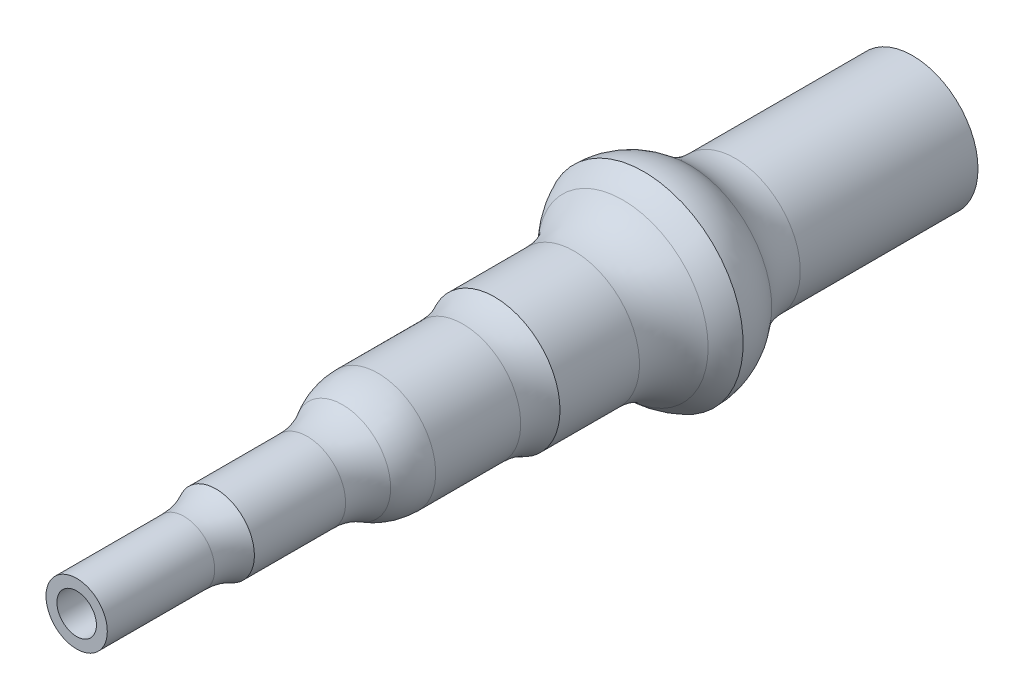
ISO-10303-21;
HEADER;
FILE_DESCRIPTION(('STEP AP214'),'2;1');
FILE_NAME('part.step','',(''),(''),'','','');
FILE_SCHEMA(('AUTOMOTIVE_DESIGN { 1 0 10303 214 1 1 1 1 }'));
ENDSEC;
DATA;
#1=APPLICATION_CONTEXT('core data for automotive mechanical design processes');
#2=APPLICATION_PROTOCOL_DEFINITION('international standard','automotive_design',2000,#1);
#3=PRODUCT_CONTEXT('',#1,'mechanical');
#4=PRODUCT('Part','Part','',(#3));
#5=PRODUCT_RELATED_PRODUCT_CATEGORY('part','',(#4));
#6=PRODUCT_DEFINITION_FORMATION('','',#4);
#7=PRODUCT_DEFINITION_CONTEXT('part definition',#1,'design');
#8=PRODUCT_DEFINITION('design','',#6,#7);
#9=PRODUCT_DEFINITION_SHAPE('','',#8);
#10=(LENGTH_UNIT() NAMED_UNIT(*) SI_UNIT(.MILLI.,.METRE.));
#11=(NAMED_UNIT(*) PLANE_ANGLE_UNIT() SI_UNIT($,.RADIAN.));
#12=(NAMED_UNIT(*) SI_UNIT($,.STERADIAN.) SOLID_ANGLE_UNIT());
#13=UNCERTAINTY_MEASURE_WITH_UNIT(LENGTH_MEASURE(1.E-05),#10,'distance_accuracy_value','');
#14=(GEOMETRIC_REPRESENTATION_CONTEXT(3) GLOBAL_UNCERTAINTY_ASSIGNED_CONTEXT((#13)) GLOBAL_UNIT_ASSIGNED_CONTEXT((#10,
#11,#12)) REPRESENTATION_CONTEXT('',''));
#15=CARTESIAN_POINT('',(0.,0.,0.));
#16=DIRECTION('',(0.,0.,1.));
#17=DIRECTION('',(1.,0.,0.));
#18=AXIS2_PLACEMENT_3D('',#15,#16,#17);
#19=CARTESIAN_POINT('',(0.,0.,30.));
#20=DIRECTION('',(0.,0.,-1.));
#21=DIRECTION('',(-1.,0.,0.));
#22=AXIS2_PLACEMENT_3D('',#19,#20,#21);
#23=CYLINDRICAL_SURFACE('',#22,4.69);
#24=CARTESIAN_POINT('',(0.,0.,24.2950060901503));
#25=DIRECTION('',(0.,0.,-1.));
#26=DIRECTION('',(-1.,0.,0.));
#27=AXIS2_PLACEMENT_3D('',#24,#25,#26);
#28=CIRCLE('',#27,4.69);
#29=CARTESIAN_POINT('',(-4.69,0.,24.2950060901503));
#30=VERTEX_POINT('',#29);
#31=EDGE_CURVE('E60',#30,#30,#28,.F.);
#32=ORIENTED_EDGE('',*,*,#31,.T.);
#33=EDGE_LOOP('',(#32));
#34=FACE_BOUND('',#33,.T.);
#35=CARTESIAN_POINT('',(0.,0.,30.));
#36=DIRECTION('',(0.,0.,1.));
#37=DIRECTION('',(1.,0.,0.));
#38=AXIS2_PLACEMENT_3D('',#35,#36,#37);
#39=CIRCLE('',#38,4.69);
#40=CARTESIAN_POINT('',(4.69,0.,30.));
#41=VERTEX_POINT('',#40);
#42=EDGE_CURVE('E96',#41,#41,#39,.T.);
#43=ORIENTED_EDGE('',*,*,#42,.F.);
#44=EDGE_LOOP('',(#43));
#45=FACE_BOUND('',#44,.T.);
#46=ADVANCED_FACE('F31',(#34,#45),#23,.T.);
#47=CARTESIAN_POINT('',(0.,0.,40.));
#48=DIRECTION('',(0.,0.,-1.));
#49=DIRECTION('',(-1.,0.,0.));
#50=AXIS2_PLACEMENT_3D('',#47,#48,#49);
#51=CYLINDRICAL_SURFACE('',#50,4.14334423021434);
#52=CARTESIAN_POINT('',(0.,0.,32.2732631099845));
#53=DIRECTION('',(0.,0.,-1.));
#54=DIRECTION('',(-1.,0.,0.));
#55=AXIS2_PLACEMENT_3D('',#52,#53,#54);
#56=CIRCLE('',#55,4.14334423021434);
#57=CARTESIAN_POINT('',(-4.14334423021434,0.,32.2732631099845));
#58=VERTEX_POINT('',#57);
#59=EDGE_CURVE('E63',#58,#58,#56,.F.);
#60=ORIENTED_EDGE('',*,*,#59,.T.);
#61=EDGE_LOOP('',(#60));
#62=FACE_BOUND('',#61,.T.);
#63=CARTESIAN_POINT('',(0.,0.,38.3759198147124));
#64=DIRECTION('',(0.,0.,-1.));
#65=DIRECTION('',(-1.,0.,0.));
#66=AXIS2_PLACEMENT_3D('',#63,#64,#65);
#67=CIRCLE('',#66,4.14334423021434);
#68=CARTESIAN_POINT('',(-4.14334423021434,0.,38.3759198147124));
#69=VERTEX_POINT('',#68);
#70=EDGE_CURVE('E66',#69,#69,#67,.T.);
#71=ORIENTED_EDGE('',*,*,#70,.T.);
#72=EDGE_LOOP('',(#71));
#73=FACE_BOUND('',#72,.T.);
#74=ADVANCED_FACE('F136',(#62,#73),#51,.T.);
#75=CARTESIAN_POINT('',(0.,0.,40.));
#76=DIRECTION('',(0.,0.,-1.));
#77=DIRECTION('',(-1.,0.,0.));
#78=AXIS2_PLACEMENT_3D('',#75,#76,#77);
#79=CYLINDRICAL_SURFACE('',#78,2.73982414802436);
#80=CARTESIAN_POINT('',(0.,0.,33.0380674905884));
#81=DIRECTION('',(0.,0.,-1.));
#82=DIRECTION('',(-1.,0.,0.));
#83=AXIS2_PLACEMENT_3D('',#80,#81,#82);
#84=CIRCLE('',#83,2.73982414802436);
#85=CARTESIAN_POINT('',(-2.73982414802436,0.,33.0380674905884));
#86=VERTEX_POINT('',#85);
#87=EDGE_CURVE('E42',#86,#86,#84,.T.);
#88=ORIENTED_EDGE('',*,*,#87,.T.);
#89=EDGE_LOOP('',(#88));
#90=FACE_BOUND('',#89,.T.);
#91=CARTESIAN_POINT('',(0.,0.,38.5935648672262));
#92=DIRECTION('',(0.,0.,1.));
#93=DIRECTION('',(1.,0.,0.));
#94=AXIS2_PLACEMENT_3D('',#91,#92,#93);
#95=CIRCLE('',#94,2.73982414802436);
#96=CARTESIAN_POINT('',(2.73982414802436,0.,38.5935648672262));
#97=VERTEX_POINT('',#96);
#98=EDGE_CURVE('E75',#97,#97,#95,.T.);
#99=ORIENTED_EDGE('',*,*,#98,.T.);
#100=EDGE_LOOP('',(#99));
#101=FACE_BOUND('',#100,.T.);
#102=ADVANCED_FACE('F141',(#90,#101),#79,.F.);
#103=CARTESIAN_POINT('',(0.,0.,50.));
#104=DIRECTION('',(0.,0.,-1.));
#105=DIRECTION('',(-1.,0.,0.));
#106=AXIS2_PLACEMENT_3D('',#103,#104,#105);
#107=CYLINDRICAL_SURFACE('',#106,2.75719872310931);
#108=CARTESIAN_POINT('',(0.,0.,43.4554385690072));
#109=DIRECTION('',(0.,0.,-1.));
#110=DIRECTION('',(-1.,0.,0.));
#111=AXIS2_PLACEMENT_3D('',#108,#109,#110);
#112=CIRCLE('',#111,2.75719872310931);
#113=CARTESIAN_POINT('',(-2.75719872310931,0.,43.4554385690072));
#114=VERTEX_POINT('',#113);
#115=EDGE_CURVE('E78',#114,#114,#112,.F.);
#116=ORIENTED_EDGE('',*,*,#115,.T.);
#117=EDGE_LOOP('',(#116));
#118=FACE_BOUND('',#117,.T.);
#119=CARTESIAN_POINT('',(0.,0.,50.));
#120=DIRECTION('',(0.,0.,1.));
#121=DIRECTION('',(1.,0.,0.));
#122=AXIS2_PLACEMENT_3D('',#119,#120,#121);
#123=CIRCLE('',#122,2.75719872310931);
#124=CARTESIAN_POINT('',(2.75719872310931,0.,50.));
#125=VERTEX_POINT('',#124);
#126=EDGE_CURVE('E100',#125,#125,#123,.T.);
#127=ORIENTED_EDGE('',*,*,#126,.F.);
#128=EDGE_LOOP('',(#127));
#129=FACE_BOUND('',#128,.T.);
#130=ADVANCED_FACE('F165',(#118,#129),#107,.T.);
#131=CARTESIAN_POINT('',(0.,0.,50.));
#132=DIRECTION('',(0.,0.,-1.));
#133=DIRECTION('',(-1.,0.,0.));
#134=AXIS2_PLACEMENT_3D('',#131,#132,#133);
#135=CYLINDRICAL_SURFACE('',#134,1.67402831957278);
#136=CARTESIAN_POINT('',(0.,0.,43.0857798911411));
#137=DIRECTION('',(0.,0.,-1.));
#138=DIRECTION('',(-1.,0.,0.));
#139=AXIS2_PLACEMENT_3D('',#136,#137,#138);
#140=CIRCLE('',#139,1.67402831957278);
#141=CARTESIAN_POINT('',(-1.67402831957278,0.,43.0857798911411));
#142=VERTEX_POINT('',#141);
#143=EDGE_CURVE('E81',#142,#142,#140,.T.);
#144=ORIENTED_EDGE('',*,*,#143,.T.);
#145=EDGE_LOOP('',(#144));
#146=FACE_BOUND('',#145,.T.);
#147=CARTESIAN_POINT('',(0.,0.,49.3307572842467));
#148=DIRECTION('',(0.,0.,1.));
#149=DIRECTION('',(1.,0.,0.));
#150=AXIS2_PLACEMENT_3D('',#147,#148,#149);
#151=CIRCLE('',#150,1.67402831957278);
#152=CARTESIAN_POINT('',(1.67402831957278,0.,49.3307572842467));
#153=VERTEX_POINT('',#152);
#154=EDGE_CURVE('E90',#153,#153,#151,.T.);
#155=ORIENTED_EDGE('',*,*,#154,.T.);
#156=EDGE_LOOP('',(#155));
#157=FACE_BOUND('',#156,.T.);
#158=ADVANCED_FACE('F168',(#146,#157),#135,.F.);
#159=CARTESIAN_POINT('',(0.,0.,60.));
#160=DIRECTION('',(0.,0.,1.));
#161=DIRECTION('',(1.,0.,0.));
#162=AXIS2_PLACEMENT_3D('',#159,#160,#161);
#163=PLANE('',#162);
#164=CARTESIAN_POINT('',(0.,0.,60.));
#165=DIRECTION('',(0.,0.,1.));
#166=DIRECTION('',(1.,0.,0.));
#167=AXIS2_PLACEMENT_3D('',#164,#165,#166);
#168=CIRCLE('',#167,2.2);
#169=CARTESIAN_POINT('',(2.2,0.,60.));
#170=VERTEX_POINT('',#169);
#171=EDGE_CURVE('E105',#170,#170,#168,.T.);
#172=ORIENTED_EDGE('',*,*,#171,.T.);
#173=EDGE_LOOP('',(#172));
#174=FACE_BOUND('',#173,.T.);
#175=CARTESIAN_POINT('',(0.,0.,60.));
#176=DIRECTION('',(0.,0.,1.));
#177=DIRECTION('',(1.,0.,0.));
#178=AXIS2_PLACEMENT_3D('',#175,#176,#177);
#179=CIRCLE('',#178,1.41771522397472);
#180=CARTESIAN_POINT('',(1.41771522397472,0.,60.));
#181=VERTEX_POINT('',#180);
#182=EDGE_CURVE('E108',#181,#181,#179,.T.);
#183=ORIENTED_EDGE('',*,*,#182,.F.);
#184=EDGE_LOOP('',(#183));
#185=FACE_BOUND('',#184,.T.);
#186=ADVANCED_FACE('F183',(#174,#185),#163,.T.);
#187=CARTESIAN_POINT('',(0.,0.,60.));
#188=DIRECTION('',(0.,0.,-1.));
#189=DIRECTION('',(-1.,0.,0.));
#190=AXIS2_PLACEMENT_3D('',#187,#188,#189);
#191=CYLINDRICAL_SURFACE('',#190,2.2);
#192=CARTESIAN_POINT('',(0.,0.,52.293799645579));
#193=DIRECTION('',(0.,0.,-1.));
#194=DIRECTION('',(-1.,0.,0.));
#195=AXIS2_PLACEMENT_3D('',#192,#193,#194);
#196=CIRCLE('',#195,2.2);
#197=CARTESIAN_POINT('',(-2.2,0.,52.293799645579));
#198=VERTEX_POINT('',#197);
#199=EDGE_CURVE('E84',#198,#198,#196,.F.);
#200=ORIENTED_EDGE('',*,*,#199,.T.);
#201=EDGE_LOOP('',(#200));
#202=FACE_BOUND('',#201,.T.);
#203=ORIENTED_EDGE('',*,*,#171,.F.);
#204=EDGE_LOOP('',(#203));
#205=FACE_BOUND('',#204,.T.);
#206=ADVANCED_FACE('F179',(#202,#205),#191,.T.);
#207=CARTESIAN_POINT('',(0.,0.,60.));
#208=DIRECTION('',(0.,0.,-1.));
#209=DIRECTION('',(-1.,0.,0.));
#210=AXIS2_PLACEMENT_3D('',#207,#208,#209);
#211=CYLINDRICAL_SURFACE('',#210,1.41771522397472);
#212=CARTESIAN_POINT('',(0.,0.,51.5803273562795));
#213=DIRECTION('',(0.,0.,-1.));
#214=DIRECTION('',(-1.,0.,0.));
#215=AXIS2_PLACEMENT_3D('',#212,#213,#214);
#216=CIRCLE('',#215,1.41771522397472);
#217=CARTESIAN_POINT('',(-1.41771522397472,0.,51.5803273562795));
#218=VERTEX_POINT('',#217);
#219=EDGE_CURVE('E93',#218,#218,#216,.T.);
#220=ORIENTED_EDGE('',*,*,#219,.T.);
#221=EDGE_LOOP('',(#220));
#222=FACE_BOUND('',#221,.T.);
#223=ORIENTED_EDGE('',*,*,#182,.T.);
#224=EDGE_LOOP('',(#223));
#225=FACE_BOUND('',#224,.T.);
#226=ADVANCED_FACE('F182',(#222,#225),#211,.F.);
#227=CARTESIAN_POINT('',(0.,0.,51.5803273562795));
#228=DIRECTION('',(0.,0.,-1.));
#229=DIRECTION('',(-1.,0.,0.));
#230=AXIS2_PLACEMENT_3D('',#227,#228,#229);
#231=TOROIDAL_SURFACE('',#230,6.41771522397472,5.);
#232=CARTESIAN_POINT('',(0.,0.,50.4555423202631));
#233=DIRECTION('',(0.,0.,1.));
#234=DIRECTION('',(1.,0.,0.));
#235=AXIS2_PLACEMENT_3D('',#232,#233,#234);
#236=CIRCLE('',#235,1.54587177177375);
#237=CARTESIAN_POINT('',(1.54587177177375,0.,50.4555423202631));
#238=VERTEX_POINT('',#237);
#239=EDGE_CURVE('E87',#238,#238,#236,.F.);
#240=ORIENTED_EDGE('',*,*,#239,.T.);
#241=EDGE_LOOP('',(#240));
#242=FACE_BOUND('',#241,.T.);
#243=ORIENTED_EDGE('',*,*,#219,.F.);
#244=EDGE_LOOP('',(#243));
#245=FACE_BOUND('',#244,.T.);
#246=ADVANCED_FACE('F193',(#242,#245),#231,.T.);
#247=CARTESIAN_POINT('',(0.,0.,49.3307572842467));
#248=DIRECTION('',(0.,0.,1.));
#249=DIRECTION('',(1.,0.,0.));
#250=AXIS2_PLACEMENT_3D('',#247,#248,#249);
#251=DEGENERATE_TOROIDAL_SURFACE('',#250,3.32597168042722,5.,.F.);
#252=ORIENTED_EDGE('',*,*,#239,.F.);
#253=EDGE_LOOP('',(#252));
#254=FACE_BOUND('',#253,.T.);
#255=ORIENTED_EDGE('',*,*,#154,.F.);
#256=EDGE_LOOP('',(#255));
#257=FACE_BOUND('',#256,.T.);
#258=ADVANCED_FACE('F175',(#254,#257),#251,.T.);
#259=CARTESIAN_POINT('',(0.,0.,52.293799645579));
#260=DIRECTION('',(0.,0.,-1.));
#261=DIRECTION('',(-1.,0.,0.));
#262=AXIS2_PLACEMENT_3D('',#259,#260,#261);
#263=TOROIDAL_SURFACE('',#262,7.2,5.);
#264=ORIENTED_EDGE('',*,*,#126,.T.);
#265=EDGE_LOOP('',(#264));
#266=FACE_BOUND('',#265,.T.);
#267=ORIENTED_EDGE('',*,*,#199,.F.);
#268=EDGE_LOOP('',(#267));
#269=FACE_BOUND('',#268,.T.);
#270=ADVANCED_FACE('F172',(#266,#269),#263,.F.);
#271=CARTESIAN_POINT('',(0.,0.,43.0857798911411));
#272=DIRECTION('',(0.,0.,-1.));
#273=DIRECTION('',(-1.,0.,0.));
#274=AXIS2_PLACEMENT_3D('',#271,#272,#273);
#275=TOROIDAL_SURFACE('',#274,6.67402831957278,5.);
#276=CARTESIAN_POINT('',(0.,0.,40.8396723791837));
#277=DIRECTION('',(0.,0.,1.));
#278=DIRECTION('',(1.,0.,0.));
#279=AXIS2_PLACEMENT_3D('',#276,#277,#278);
#280=CIRCLE('',#279,2.20692623379857);
#281=CARTESIAN_POINT('',(2.20692623379857,0.,40.8396723791837));
#282=VERTEX_POINT('',#281);
#283=EDGE_CURVE('E72',#282,#282,#280,.F.);
#284=ORIENTED_EDGE('',*,*,#283,.T.);
#285=EDGE_LOOP('',(#284));
#286=FACE_BOUND('',#285,.T.);
#287=ORIENTED_EDGE('',*,*,#143,.F.);
#288=EDGE_LOOP('',(#287));
#289=FACE_BOUND('',#288,.T.);
#290=ADVANCED_FACE('F161',(#286,#289),#275,.T.);
#291=CARTESIAN_POINT('',(0.,0.,43.4554385690072));
#292=DIRECTION('',(0.,0.,-1.));
#293=DIRECTION('',(-1.,0.,0.));
#294=AXIS2_PLACEMENT_3D('',#291,#292,#293);
#295=TOROIDAL_SURFACE('',#294,7.75719872310931,5.);
#296=CARTESIAN_POINT('',(0.,0.,40.9156791918598));
#297=DIRECTION('',(0.,0.,1.));
#298=DIRECTION('',(1.,0.,0.));
#299=AXIS2_PLACEMENT_3D('',#296,#297,#298);
#300=CIRCLE('',#299,3.45027147666183);
#301=CARTESIAN_POINT('',(3.45027147666183,0.,40.9156791918598));
#302=VERTEX_POINT('',#301);
#303=EDGE_CURVE('E69',#302,#302,#300,.T.);
#304=ORIENTED_EDGE('',*,*,#303,.T.);
#305=EDGE_LOOP('',(#304));
#306=FACE_BOUND('',#305,.T.);
#307=ORIENTED_EDGE('',*,*,#115,.F.);
#308=EDGE_LOOP('',(#307));
#309=FACE_BOUND('',#308,.T.);
#310=ADVANCED_FACE('F158',(#306,#309),#295,.F.);
#311=CARTESIAN_POINT('',(0.,0.,38.5935648672262));
#312=DIRECTION('',(0.,0.,1.));
#313=DIRECTION('',(1.,0.,0.));
#314=AXIS2_PLACEMENT_3D('',#311,#312,#313);
#315=DEGENERATE_TOROIDAL_SURFACE('',#314,2.26017585197564,5.,.F.);
#316=ORIENTED_EDGE('',*,*,#283,.F.);
#317=EDGE_LOOP('',(#316));
#318=FACE_BOUND('',#317,.T.);
#319=ORIENTED_EDGE('',*,*,#98,.F.);
#320=EDGE_LOOP('',(#319));
#321=FACE_BOUND('',#320,.T.);
#322=ADVANCED_FACE('F154',(#318,#321),#315,.T.);
#323=CARTESIAN_POINT('',(0.,0.,38.3759198147124));
#324=DIRECTION('',(0.,0.,-1.));
#325=DIRECTION('',(-1.,0.,0.));
#326=AXIS2_PLACEMENT_3D('',#323,#324,#325);
#327=DEGENERATE_TOROIDAL_SURFACE('',#326,0.856655769785656,5.,.F.);
#328=ORIENTED_EDGE('',*,*,#70,.F.);
#329=EDGE_LOOP('',(#328));
#330=FACE_BOUND('',#329,.T.);
#331=ORIENTED_EDGE('',*,*,#303,.F.);
#332=EDGE_LOOP('',(#331));
#333=FACE_BOUND('',#332,.T.);
#334=ADVANCED_FACE('F131',(#330,#333),#327,.F.);
#335=CARTESIAN_POINT('',(0.,0.,32.2732631099845));
#336=DIRECTION('',(0.,0.,-1.));
#337=DIRECTION('',(-1.,0.,0.));
#338=AXIS2_PLACEMENT_3D('',#335,#336,#337);
#339=TOROIDAL_SURFACE('',#338,9.14334423021435,5.);
#340=ORIENTED_EDGE('',*,*,#42,.T.);
#341=EDGE_LOOP('',(#340));
#342=FACE_BOUND('',#341,.T.);
#343=ORIENTED_EDGE('',*,*,#59,.F.);
#344=EDGE_LOOP('',(#343));
#345=FACE_BOUND('',#344,.T.);
#346=ADVANCED_FACE('F125',(#342,#345),#339,.F.);
#347=CARTESIAN_POINT('',(0.,0.,12.7491371464307));
#348=DIRECTION('',(0.,0.,-1.));
#349=DIRECTION('',(-1.,0.,0.));
#350=AXIS2_PLACEMENT_3D('',#347,#348,#349);
#351=CIRCLE('',#350,4.69);
#352=CARTESIAN_POINT('',(-4.69,0.,12.7491371464307));
#353=VERTEX_POINT('',#352);
#354=EDGE_CURVE('E54',#353,#353,#351,.T.);
#355=ORIENTED_EDGE('',*,*,#354,.T.);
#356=EDGE_LOOP('',(#355));
#357=FACE_BOUND('',#356,.T.);
#358=CARTESIAN_POINT('',(0.,0.,0.));
#359=DIRECTION('',(0.,0.,1.));
#360=DIRECTION('',(1.,0.,0.));
#361=AXIS2_PLACEMENT_3D('',#358,#359,#360);
#362=CIRCLE('',#361,4.69);
#363=CARTESIAN_POINT('',(4.69,0.,0.));
#364=VERTEX_POINT('',#363);
#365=EDGE_CURVE('E97',#364,#364,#362,.T.);
#366=ORIENTED_EDGE('',*,*,#365,.T.);
#367=EDGE_LOOP('',(#366));
#368=FACE_BOUND('',#367,.T.);
#369=ADVANCED_FACE('F120',(#357,#368),#23,.T.);
#370=CARTESIAN_POINT('',(0.,0.,0.));
#371=DIRECTION('',(0.,0.,1.));
#372=DIRECTION('',(1.,0.,0.));
#373=AXIS2_PLACEMENT_3D('',#370,#371,#372);
#374=PLANE('',#373);
#375=CARTESIAN_POINT('',(0.,0.,0.));
#376=DIRECTION('',(0.,0.,-1.));
#377=DIRECTION('',(-1.,0.,0.));
#378=AXIS2_PLACEMENT_3D('',#375,#376,#377);
#379=CIRCLE('',#378,3.76865984487221);
#380=CARTESIAN_POINT('',(-3.76865984487221,0.,0.));
#381=VERTEX_POINT('',#380);
#382=EDGE_CURVE('E111',#381,#381,#379,.T.);
#383=ORIENTED_EDGE('',*,*,#382,.F.);
#384=EDGE_LOOP('',(#383));
#385=FACE_BOUND('',#384,.T.);
#386=ORIENTED_EDGE('',*,*,#365,.F.);
#387=EDGE_LOOP('',(#386));
#388=FACE_BOUND('',#387,.T.);
#389=ADVANCED_FACE('F117',(#385,#388),#374,.F.);
#390=CARTESIAN_POINT('',(0.,0.,30.));
#391=DIRECTION('',(0.,0.,-1.));
#392=DIRECTION('',(-1.,0.,0.));
#393=AXIS2_PLACEMENT_3D('',#390,#391,#392);
#394=CYLINDRICAL_SURFACE('',#393,3.76865984487221);
#395=CARTESIAN_POINT('',(0.,0.,28.6201255437257));
#396=DIRECTION('',(0.,0.,-1.));
#397=DIRECTION('',(-1.,0.,0.));
#398=AXIS2_PLACEMENT_3D('',#395,#396,#397);
#399=CIRCLE('',#398,3.76865984487221);
#400=CARTESIAN_POINT('',(-3.76865984487221,0.,28.6201255437257));
#401=VERTEX_POINT('',#400);
#402=EDGE_CURVE('E10',#401,#401,#399,.F.);
#403=ORIENTED_EDGE('',*,*,#402,.T.);
#404=EDGE_LOOP('',(#403));
#405=FACE_BOUND('',#404,.T.);
#406=ORIENTED_EDGE('',*,*,#382,.T.);
#407=EDGE_LOOP('',(#406));
#408=FACE_BOUND('',#407,.T.);
#409=ADVANCED_FACE('F115',(#405,#408),#394,.F.);
#410=CARTESIAN_POINT('',(0.,0.,24.2950060901503));
#411=DIRECTION('',(0.,0.,-1.));
#412=DIRECTION('',(-1.,0.,0.));
#413=AXIS2_PLACEMENT_3D('',#410,#411,#412);
#414=TOROIDAL_SURFACE('',#413,9.69,5.);
#415=CARTESIAN_POINT('',(0.,0.,20.7959394065129));
#416=DIRECTION('',(0.,0.,1.));
#417=DIRECTION('',(1.,0.,0.));
#418=AXIS2_PLACEMENT_3D('',#415,#416,#417);
#419=CIRCLE('',#418,6.11837119181474);
#420=CARTESIAN_POINT('',(6.11837119181474,0.,20.7959394065129));
#421=VERTEX_POINT('',#420);
#422=EDGE_CURVE('E46',#421,#421,#419,.T.);
#423=ORIENTED_EDGE('',*,*,#422,.T.);
#424=EDGE_LOOP('',(#423));
#425=FACE_BOUND('',#424,.T.);
#426=ORIENTED_EDGE('',*,*,#31,.F.);
#427=EDGE_LOOP('',(#426));
#428=FACE_BOUND('',#427,.T.);
#429=ADVANCED_FACE('F221',(#425,#428),#414,.F.);
#430=CARTESIAN_POINT('',(0.,0.,19.2950060901503));
#431=DIRECTION('',(0.,0.,-1.));
#432=DIRECTION('',(-1.,0.,0.));
#433=AXIS2_PLACEMENT_3D('',#430,#431,#432);
#434=DEGENERATE_TOROIDAL_SURFACE('',#433,2.13013229139242,5.,.T.);
#435=CARTESIAN_POINT('',(0.,0.,16.0220716182905));
#436=DIRECTION('',(0.,0.,1.));
#437=DIRECTION('',(1.,0.,0.));
#438=AXIS2_PLACEMENT_3D('',#435,#436,#437);
#439=CIRCLE('',#438,5.91006614569621);
#440=CARTESIAN_POINT('',(5.91006614569621,0.,16.0220716182905));
#441=VERTEX_POINT('',#440);
#442=EDGE_CURVE('E51',#441,#441,#439,.T.);
#443=ORIENTED_EDGE('',*,*,#442,.T.);
#444=EDGE_LOOP('',(#443));
#445=FACE_BOUND('',#444,.T.);
#446=CARTESIAN_POINT('',(0.,0.,19.2950060901503));
#447=DIRECTION('',(0.,0.,-1.));
#448=DIRECTION('',(-1.,0.,0.));
#449=AXIS2_PLACEMENT_3D('',#446,#447,#448);
#450=CIRCLE('',#449,7.13013229139242);
#451=CARTESIAN_POINT('',(-7.13013229139242,0.,19.2950060901503));
#452=VERTEX_POINT('',#451);
#453=EDGE_CURVE('E57',#452,#452,#450,.F.);
#454=ORIENTED_EDGE('',*,*,#453,.F.);
#455=EDGE_LOOP('',(#454));
#456=FACE_BOUND('',#455,.T.);
#457=ADVANCED_FACE('F224',(#445,#456),#434,.T.);
#458=CARTESIAN_POINT('',(0.,0.,12.7491371464307));
#459=DIRECTION('',(0.,0.,-1.));
#460=DIRECTION('',(-1.,0.,0.));
#461=AXIS2_PLACEMENT_3D('',#458,#459,#460);
#462=TOROIDAL_SURFACE('',#461,9.69,5.);
#463=ORIENTED_EDGE('',*,*,#442,.F.);
#464=EDGE_LOOP('',(#463));
#465=FACE_BOUND('',#464,.T.);
#466=ORIENTED_EDGE('',*,*,#354,.F.);
#467=EDGE_LOOP('',(#466));
#468=FACE_BOUND('',#467,.T.);
#469=ADVANCED_FACE('F228',(#465,#468),#462,.F.);
#470=CARTESIAN_POINT('',(0.,0.,17.2968727228755));
#471=DIRECTION('',(0.,0.,-1.));
#472=DIRECTION('',(-1.,0.,0.));
#473=AXIS2_PLACEMENT_3D('',#470,#471,#472);
#474=DEGENERATE_TOROIDAL_SURFACE('',#473,2.54674238362947,5.,.T.);
#475=ORIENTED_EDGE('',*,*,#422,.F.);
#476=EDGE_LOOP('',(#475));
#477=FACE_BOUND('',#476,.T.);
#478=ORIENTED_EDGE('',*,*,#453,.T.);
#479=EDGE_LOOP('',(#478));
#480=FACE_BOUND('',#479,.T.);
#481=ADVANCED_FACE('F232',(#477,#480),#474,.T.);
#482=CARTESIAN_POINT('',(0.,0.,33.0380674905884));
#483=DIRECTION('',(0.,0.,-1.));
#484=DIRECTION('',(-1.,0.,0.));
#485=AXIS2_PLACEMENT_3D('',#482,#483,#484);
#486=TOROIDAL_SURFACE('',#485,7.73982414802436,5.);
#487=CARTESIAN_POINT('',(0.,0.,30.8290965171571));
#488=DIRECTION('',(0.,0.,1.));
#489=DIRECTION('',(1.,0.,0.));
#490=AXIS2_PLACEMENT_3D('',#487,#488,#489);
#491=CIRCLE('',#490,3.25424199644829);
#492=CARTESIAN_POINT('',(3.25424199644829,0.,30.8290965171571));
#493=VERTEX_POINT('',#492);
#494=EDGE_CURVE('E38',#493,#493,#491,.F.);
#495=ORIENTED_EDGE('',*,*,#494,.T.);
#496=EDGE_LOOP('',(#495));
#497=FACE_BOUND('',#496,.T.);
#498=ORIENTED_EDGE('',*,*,#87,.F.);
#499=EDGE_LOOP('',(#498));
#500=FACE_BOUND('',#499,.T.);
#501=ADVANCED_FACE('F235',(#497,#500),#486,.T.);
#502=CARTESIAN_POINT('',(0.,0.,28.6201255437257));
#503=DIRECTION('',(0.,0.,-1.));
#504=DIRECTION('',(-1.,0.,0.));
#505=AXIS2_PLACEMENT_3D('',#502,#503,#504);
#506=DEGENERATE_TOROIDAL_SURFACE('',#505,1.23134015512778,5.,.F.);
#507=ORIENTED_EDGE('',*,*,#402,.F.);
#508=EDGE_LOOP('',(#507));
#509=FACE_BOUND('',#508,.T.);
#510=ORIENTED_EDGE('',*,*,#494,.F.);
#511=EDGE_LOOP('',(#510));
#512=FACE_BOUND('',#511,.T.);
#513=ADVANCED_FACE('F33',(#509,#512),#506,.T.);
#514=CLOSED_SHELL('',(#46,#74,#102,#130,#158,#186,#206,#226,#246,#258,#270,#290,#310,#322,#334,
#346,#369,#389,#409,#429,#457,#469,#481,#501,#513));
#515=MANIFOLD_SOLID_BREP('B2',#514);
#516=ADVANCED_BREP_SHAPE_REPRESENTATION('',(#18,#515),#14);
#517=SHAPE_DEFINITION_REPRESENTATION(#9,#516);
ENDSEC;
END-ISO-10303-21;
